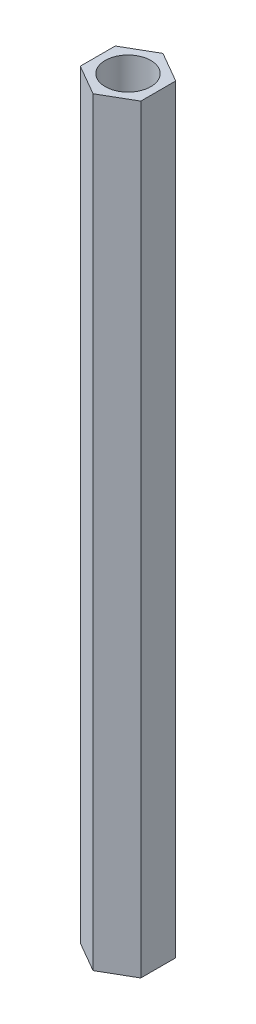
ISO-10303-21;
HEADER;
FILE_DESCRIPTION(('STEP AP214'),'2;1');
FILE_NAME('part.step','',(''),(''),'','','');
FILE_SCHEMA(('AUTOMOTIVE_DESIGN { 1 0 10303 214 1 1 1 1 }'));
ENDSEC;
DATA;
#1=APPLICATION_CONTEXT('core data for automotive mechanical design processes');
#2=APPLICATION_PROTOCOL_DEFINITION('international standard','automotive_design',2000,#1);
#3=PRODUCT_CONTEXT('',#1,'mechanical');
#4=PRODUCT('Part','Part','',(#3));
#5=PRODUCT_RELATED_PRODUCT_CATEGORY('part','',(#4));
#6=PRODUCT_DEFINITION_FORMATION('','',#4);
#7=PRODUCT_DEFINITION_CONTEXT('part definition',#1,'design');
#8=PRODUCT_DEFINITION('design','',#6,#7);
#9=PRODUCT_DEFINITION_SHAPE('','',#8);
#10=(LENGTH_UNIT() NAMED_UNIT(*) SI_UNIT(.MILLI.,.METRE.));
#11=(NAMED_UNIT(*) PLANE_ANGLE_UNIT() SI_UNIT($,.RADIAN.));
#12=(NAMED_UNIT(*) SI_UNIT($,.STERADIAN.) SOLID_ANGLE_UNIT());
#13=UNCERTAINTY_MEASURE_WITH_UNIT(LENGTH_MEASURE(1.E-05),#10,'distance_accuracy_value','');
#14=(GEOMETRIC_REPRESENTATION_CONTEXT(3) GLOBAL_UNCERTAINTY_ASSIGNED_CONTEXT((#13)) GLOBAL_UNIT_ASSIGNED_CONTEXT((#10,
#11,#12)) REPRESENTATION_CONTEXT('',''));
#15=CARTESIAN_POINT('',(0.,0.,0.));
#16=DIRECTION('',(0.,0.,1.));
#17=DIRECTION('',(1.,0.,0.));
#18=AXIS2_PLACEMENT_3D('',#15,#16,#17);
#19=CARTESIAN_POINT('',(0.,50.,0.));
#20=DIRECTION('',(0.,1.,0.));
#21=DIRECTION('',(0.,0.,1.));
#22=AXIS2_PLACEMENT_3D('',#19,#20,#21);
#23=PLANE('',#22);
#24=DIRECTION('',(-0.866025403784439,0.,-0.5));
#25=VECTOR('',#24,1.);
#26=CARTESIAN_POINT('',(1.99185842870421,50.,-1.15));
#27=LINE('',#26,#25);
#28=CARTESIAN_POINT('',(1.99185842870421,50.,-1.15));
#29=VERTEX_POINT('',#28);
#30=CARTESIAN_POINT('',(0.,50.,-2.3));
#31=VERTEX_POINT('',#30);
#32=EDGE_CURVE('E137',#29,#31,#27,.T.);
#33=ORIENTED_EDGE('',*,*,#32,.T.);
#34=DIRECTION('',(-0.866025403784439,0.,0.5));
#35=VECTOR('',#34,1.);
#36=CARTESIAN_POINT('',(0.,50.,-2.3));
#37=LINE('',#36,#35);
#38=CARTESIAN_POINT('',(-1.99185842870421,50.,-1.15));
#39=VERTEX_POINT('',#38);
#40=EDGE_CURVE('E95',#31,#39,#37,.T.);
#41=ORIENTED_EDGE('',*,*,#40,.T.);
#42=DIRECTION('',(0.,0.,1.));
#43=VECTOR('',#42,1.);
#44=CARTESIAN_POINT('',(-1.99185842870421,50.,-1.15));
#45=LINE('',#44,#43);
#46=CARTESIAN_POINT('',(-1.99185842870421,50.,1.15));
#47=VERTEX_POINT('',#46);
#48=EDGE_CURVE('E108',#39,#47,#45,.T.);
#49=ORIENTED_EDGE('',*,*,#48,.T.);
#50=DIRECTION('',(0.866025403784439,0.,0.5));
#51=VECTOR('',#50,1.);
#52=CARTESIAN_POINT('',(-1.99185842870421,50.,1.15));
#53=LINE('',#52,#51);
#54=CARTESIAN_POINT('',(0.,50.,2.3));
#55=VERTEX_POINT('',#54);
#56=EDGE_CURVE('E102',#47,#55,#53,.T.);
#57=ORIENTED_EDGE('',*,*,#56,.T.);
#58=DIRECTION('',(0.866025403784439,0.,-0.5));
#59=VECTOR('',#58,1.);
#60=CARTESIAN_POINT('',(0.,50.,2.3));
#61=LINE('',#60,#59);
#62=CARTESIAN_POINT('',(1.99185842870421,50.,1.15));
#63=VERTEX_POINT('',#62);
#64=EDGE_CURVE('E106',#55,#63,#61,.T.);
#65=ORIENTED_EDGE('',*,*,#64,.T.);
#66=DIRECTION('',(0.,0.,-1.));
#67=VECTOR('',#66,1.);
#68=CARTESIAN_POINT('',(1.99185842870421,50.,1.15));
#69=LINE('',#68,#67);
#70=EDGE_CURVE('E58',#63,#29,#69,.T.);
#71=ORIENTED_EDGE('',*,*,#70,.T.);
#72=EDGE_LOOP('',(#33,#41,#49,#57,#65,#71));
#73=FACE_BOUND('',#72,.T.);
#74=CARTESIAN_POINT('',(0.,50.,0.));
#75=DIRECTION('',(0.,1.,0.));
#76=DIRECTION('',(0.,0.,1.));
#77=AXIS2_PLACEMENT_3D('',#74,#75,#76);
#78=CIRCLE('',#77,1.5);
#79=CARTESIAN_POINT('',(0.,50.,1.5));
#80=VERTEX_POINT('',#79);
#81=EDGE_CURVE('E130',#80,#80,#78,.T.);
#82=ORIENTED_EDGE('',*,*,#81,.F.);
#83=EDGE_LOOP('',(#82));
#84=FACE_BOUND('',#83,.T.);
#85=ADVANCED_FACE('F41',(#73,#84),#23,.T.);
#86=CARTESIAN_POINT('',(0.,0.,0.));
#87=DIRECTION('',(0.,1.,0.));
#88=DIRECTION('',(0.,0.,1.));
#89=AXIS2_PLACEMENT_3D('',#86,#87,#88);
#90=PLANE('',#89);
#91=DIRECTION('',(-0.866025403784439,0.,-0.5));
#92=VECTOR('',#91,1.);
#93=CARTESIAN_POINT('',(1.99185842870421,0.,-1.15));
#94=LINE('',#93,#92);
#95=CARTESIAN_POINT('',(1.99185842870421,0.,-1.15));
#96=VERTEX_POINT('',#95);
#97=CARTESIAN_POINT('',(0.,0.,-2.3));
#98=VERTEX_POINT('',#97);
#99=EDGE_CURVE('E126',#96,#98,#94,.T.);
#100=ORIENTED_EDGE('',*,*,#99,.F.);
#101=DIRECTION('',(0.,0.,-1.));
#102=VECTOR('',#101,1.);
#103=CARTESIAN_POINT('',(1.99185842870421,0.,1.15));
#104=LINE('',#103,#102);
#105=CARTESIAN_POINT('',(1.99185842870421,0.,1.15));
#106=VERTEX_POINT('',#105);
#107=EDGE_CURVE('E87',#106,#96,#104,.T.);
#108=ORIENTED_EDGE('',*,*,#107,.F.);
#109=DIRECTION('',(0.866025403784439,0.,-0.5));
#110=VECTOR('',#109,1.);
#111=CARTESIAN_POINT('',(0.,0.,2.3));
#112=LINE('',#111,#110);
#113=CARTESIAN_POINT('',(0.,0.,2.3));
#114=VERTEX_POINT('',#113);
#115=EDGE_CURVE('E81',#114,#106,#112,.T.);
#116=ORIENTED_EDGE('',*,*,#115,.F.);
#117=DIRECTION('',(0.866025403784439,0.,0.5));
#118=VECTOR('',#117,1.);
#119=CARTESIAN_POINT('',(-1.99185842870421,0.,1.15));
#120=LINE('',#119,#118);
#121=CARTESIAN_POINT('',(-1.99185842870421,0.,1.15));
#122=VERTEX_POINT('',#121);
#123=EDGE_CURVE('E116',#122,#114,#120,.T.);
#124=ORIENTED_EDGE('',*,*,#123,.F.);
#125=DIRECTION('',(0.,0.,1.));
#126=VECTOR('',#125,1.);
#127=CARTESIAN_POINT('',(-1.99185842870421,0.,-1.15));
#128=LINE('',#127,#126);
#129=CARTESIAN_POINT('',(-1.99185842870421,0.,-1.15));
#130=VERTEX_POINT('',#129);
#131=EDGE_CURVE('E132',#130,#122,#128,.T.);
#132=ORIENTED_EDGE('',*,*,#131,.F.);
#133=DIRECTION('',(-0.866025403784439,0.,0.5));
#134=VECTOR('',#133,1.);
#135=CARTESIAN_POINT('',(0.,0.,-2.3));
#136=LINE('',#135,#134);
#137=EDGE_CURVE('E129',#98,#130,#136,.T.);
#138=ORIENTED_EDGE('',*,*,#137,.F.);
#139=EDGE_LOOP('',(#100,#108,#116,#124,#132,#138));
#140=FACE_BOUND('',#139,.T.);
#141=CARTESIAN_POINT('',(0.,0.,0.));
#142=DIRECTION('',(0.,1.,0.));
#143=DIRECTION('',(0.,0.,1.));
#144=AXIS2_PLACEMENT_3D('',#141,#142,#143);
#145=CIRCLE('',#144,1.5);
#146=CARTESIAN_POINT('',(0.,0.,1.5));
#147=VERTEX_POINT('',#146);
#148=EDGE_CURVE('E230',#147,#147,#145,.T.);
#149=ORIENTED_EDGE('',*,*,#148,.T.);
#150=EDGE_LOOP('',(#149));
#151=FACE_BOUND('',#150,.T.);
#152=ADVANCED_FACE('F146',(#140,#151),#90,.F.);
#153=CARTESIAN_POINT('',(1.99185842870421,50.,-1.15));
#154=DIRECTION('',(-0.5,0.,0.866025403784439));
#155=DIRECTION('',(0.866025403784439,0.,0.5));
#156=AXIS2_PLACEMENT_3D('',#153,#154,#155);
#157=PLANE('',#156);
#158=ORIENTED_EDGE('',*,*,#99,.T.);
#159=DIRECTION('',(0.,-1.,0.));
#160=VECTOR('',#159,1.);
#161=CARTESIAN_POINT('',(0.,50.,-2.3));
#162=LINE('',#161,#160);
#163=EDGE_CURVE('E11',#31,#98,#162,.T.);
#164=ORIENTED_EDGE('',*,*,#163,.F.);
#165=ORIENTED_EDGE('',*,*,#32,.F.);
#166=DIRECTION('',(0.,-1.,0.));
#167=VECTOR('',#166,1.);
#168=CARTESIAN_POINT('',(1.99185842870421,50.,-1.15));
#169=LINE('',#168,#167);
#170=EDGE_CURVE('E122',#29,#96,#169,.T.);
#171=ORIENTED_EDGE('',*,*,#170,.T.);
#172=EDGE_LOOP('',(#158,#164,#165,#171));
#173=FACE_BOUND('',#172,.T.);
#174=ADVANCED_FACE('F43',(#173),#157,.F.);
#175=CARTESIAN_POINT('',(0.,50.,-2.3));
#176=DIRECTION('',(0.5,0.,0.866025403784439));
#177=DIRECTION('',(0.866025403784439,0.,-0.5));
#178=AXIS2_PLACEMENT_3D('',#175,#176,#177);
#179=PLANE('',#178);
#180=ORIENTED_EDGE('',*,*,#137,.T.);
#181=DIRECTION('',(0.,-1.,0.));
#182=VECTOR('',#181,1.);
#183=CARTESIAN_POINT('',(-1.99185842870421,50.,-1.15));
#184=LINE('',#183,#182);
#185=EDGE_CURVE('E50',#39,#130,#184,.T.);
#186=ORIENTED_EDGE('',*,*,#185,.F.);
#187=ORIENTED_EDGE('',*,*,#40,.F.);
#188=ORIENTED_EDGE('',*,*,#163,.T.);
#189=EDGE_LOOP('',(#180,#186,#187,#188));
#190=FACE_BOUND('',#189,.T.);
#191=ADVANCED_FACE('F171',(#190),#179,.F.);
#192=CARTESIAN_POINT('',(-1.99185842870421,50.,-1.15));
#193=DIRECTION('',(1.,0.,0.));
#194=DIRECTION('',(0.,0.,-1.));
#195=AXIS2_PLACEMENT_3D('',#192,#193,#194);
#196=PLANE('',#195);
#197=ORIENTED_EDGE('',*,*,#131,.T.);
#198=DIRECTION('',(0.,-1.,0.));
#199=VECTOR('',#198,1.);
#200=CARTESIAN_POINT('',(-1.99185842870421,50.,1.15));
#201=LINE('',#200,#199);
#202=EDGE_CURVE('E117',#47,#122,#201,.T.);
#203=ORIENTED_EDGE('',*,*,#202,.F.);
#204=ORIENTED_EDGE('',*,*,#48,.F.);
#205=ORIENTED_EDGE('',*,*,#185,.T.);
#206=EDGE_LOOP('',(#197,#203,#204,#205));
#207=FACE_BOUND('',#206,.T.);
#208=ADVANCED_FACE('F143',(#207),#196,.F.);
#209=CARTESIAN_POINT('',(-1.99185842870421,50.,1.15));
#210=DIRECTION('',(0.5,0.,-0.866025403784439));
#211=DIRECTION('',(-0.866025403784439,0.,-0.5));
#212=AXIS2_PLACEMENT_3D('',#209,#210,#211);
#213=PLANE('',#212);
#214=ORIENTED_EDGE('',*,*,#123,.T.);
#215=DIRECTION('',(0.,-1.,0.));
#216=VECTOR('',#215,1.);
#217=CARTESIAN_POINT('',(0.,50.,2.3));
#218=LINE('',#217,#216);
#219=EDGE_CURVE('E113',#55,#114,#218,.T.);
#220=ORIENTED_EDGE('',*,*,#219,.F.);
#221=ORIENTED_EDGE('',*,*,#56,.F.);
#222=ORIENTED_EDGE('',*,*,#202,.T.);
#223=EDGE_LOOP('',(#214,#220,#221,#222));
#224=FACE_BOUND('',#223,.T.);
#225=ADVANCED_FACE('F114',(#224),#213,.F.);
#226=CARTESIAN_POINT('',(0.,50.,2.3));
#227=DIRECTION('',(-0.5,0.,-0.866025403784439));
#228=DIRECTION('',(-0.866025403784439,0.,0.5));
#229=AXIS2_PLACEMENT_3D('',#226,#227,#228);
#230=PLANE('',#229);
#231=ORIENTED_EDGE('',*,*,#115,.T.);
#232=DIRECTION('',(0.,-1.,0.));
#233=VECTOR('',#232,1.);
#234=CARTESIAN_POINT('',(1.99185842870421,50.,1.15));
#235=LINE('',#234,#233);
#236=EDGE_CURVE('E118',#63,#106,#235,.T.);
#237=ORIENTED_EDGE('',*,*,#236,.F.);
#238=ORIENTED_EDGE('',*,*,#64,.F.);
#239=ORIENTED_EDGE('',*,*,#219,.T.);
#240=EDGE_LOOP('',(#231,#237,#238,#239));
#241=FACE_BOUND('',#240,.T.);
#242=ADVANCED_FACE('F120',(#241),#230,.F.);
#243=CARTESIAN_POINT('',(1.99185842870421,50.,1.15));
#244=DIRECTION('',(-1.,0.,0.));
#245=DIRECTION('',(0.,0.,1.));
#246=AXIS2_PLACEMENT_3D('',#243,#244,#245);
#247=PLANE('',#246);
#248=ORIENTED_EDGE('',*,*,#107,.T.);
#249=ORIENTED_EDGE('',*,*,#170,.F.);
#250=ORIENTED_EDGE('',*,*,#70,.F.);
#251=ORIENTED_EDGE('',*,*,#236,.T.);
#252=EDGE_LOOP('',(#248,#249,#250,#251));
#253=FACE_BOUND('',#252,.T.);
#254=ADVANCED_FACE('F151',(#253),#247,.F.);
#255=CARTESIAN_POINT('',(0.,50.,0.));
#256=DIRECTION('',(0.,-1.,0.));
#257=DIRECTION('',(0.,0.,-1.));
#258=AXIS2_PLACEMENT_3D('',#255,#256,#257);
#259=CYLINDRICAL_SURFACE('',#258,1.5);
#260=ORIENTED_EDGE('',*,*,#81,.T.);
#261=EDGE_LOOP('',(#260));
#262=FACE_BOUND('',#261,.T.);
#263=ORIENTED_EDGE('',*,*,#148,.F.);
#264=EDGE_LOOP('',(#263));
#265=FACE_BOUND('',#264,.T.);
#266=ADVANCED_FACE('F153',(#262,#265),#259,.F.);
#267=CLOSED_SHELL('',(#85,#152,#174,#191,#208,#225,#242,#254,#266));
#268=MANIFOLD_SOLID_BREP('B2',#267);
#269=ADVANCED_BREP_SHAPE_REPRESENTATION('',(#18,#268),#14);
#270=SHAPE_DEFINITION_REPRESENTATION(#9,#269);
ENDSEC;
END-ISO-10303-21;
